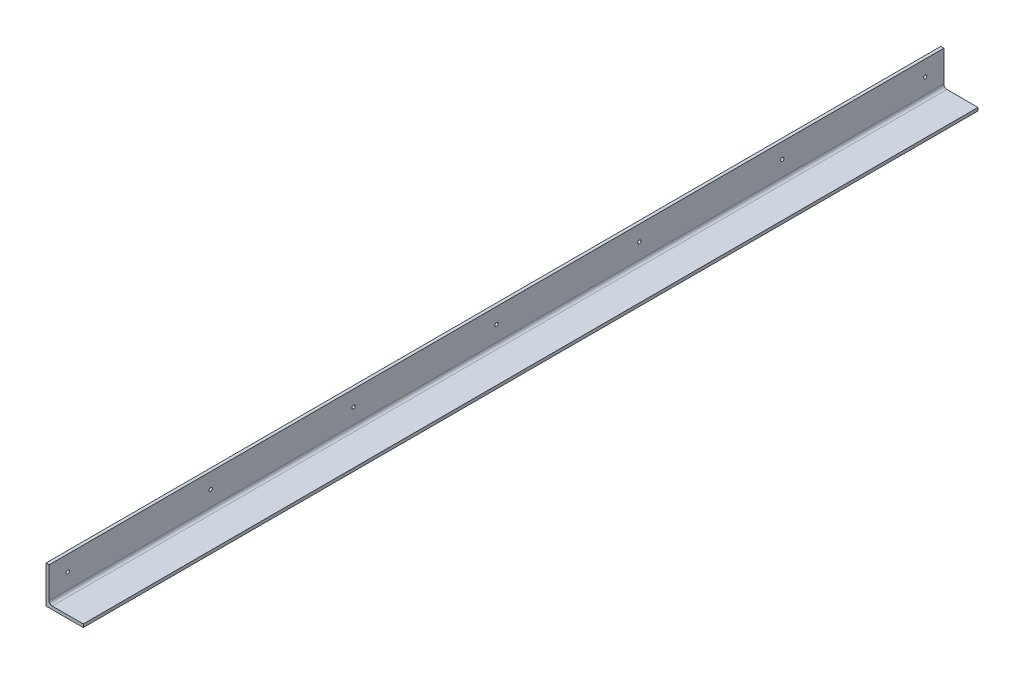
ISO-10303-21;
HEADER;
FILE_DESCRIPTION(('STEP AP214'),'2;1');
FILE_NAME('part.step','',(''),(''),'','','');
FILE_SCHEMA(('AUTOMOTIVE_DESIGN { 1 0 10303 214 1 1 1 1 }'));
ENDSEC;
DATA;
#1=APPLICATION_CONTEXT('core data for automotive mechanical design processes');
#2=APPLICATION_PROTOCOL_DEFINITION('international standard','automotive_design',2000,#1);
#3=PRODUCT_CONTEXT('',#1,'mechanical');
#4=PRODUCT('Part','Part','',(#3));
#5=PRODUCT_RELATED_PRODUCT_CATEGORY('part','',(#4));
#6=PRODUCT_DEFINITION_FORMATION('','',#4);
#7=PRODUCT_DEFINITION_CONTEXT('part definition',#1,'design');
#8=PRODUCT_DEFINITION('design','',#6,#7);
#9=PRODUCT_DEFINITION_SHAPE('','',#8);
#10=(LENGTH_UNIT() NAMED_UNIT(*) SI_UNIT(.MILLI.,.METRE.));
#11=(NAMED_UNIT(*) PLANE_ANGLE_UNIT() SI_UNIT($,.RADIAN.));
#12=(NAMED_UNIT(*) SI_UNIT($,.STERADIAN.) SOLID_ANGLE_UNIT());
#13=UNCERTAINTY_MEASURE_WITH_UNIT(LENGTH_MEASURE(1.E-05),#10,'distance_accuracy_value','');
#14=(GEOMETRIC_REPRESENTATION_CONTEXT(3) GLOBAL_UNCERTAINTY_ASSIGNED_CONTEXT((#13)) GLOBAL_UNIT_ASSIGNED_CONTEXT((#10,
#11,#12)) REPRESENTATION_CONTEXT('',''));
#15=CARTESIAN_POINT('',(0.,0.,0.));
#16=DIRECTION('',(0.,0.,1.));
#17=DIRECTION('',(1.,0.,0.));
#18=AXIS2_PLACEMENT_3D('',#15,#16,#17);
#19=CARTESIAN_POINT('',(76.2,0.,1828.8));
#20=DIRECTION('',(0.,1.,0.));
#21=DIRECTION('',(-1.,0.,0.));
#22=AXIS2_PLACEMENT_3D('',#19,#20,#21);
#23=PLANE('',#22);
#24=DIRECTION('',(1.,0.,0.));
#25=VECTOR('',#24,1.);
#26=CARTESIAN_POINT('',(76.2,0.,0.));
#27=LINE('',#26,#25);
#28=CARTESIAN_POINT('',(0.,0.,0.));
#29=VERTEX_POINT('',#28);
#30=CARTESIAN_POINT('',(76.2,0.,0.));
#31=VERTEX_POINT('',#30);
#32=EDGE_CURVE('E126',#29,#31,#27,.T.);
#33=ORIENTED_EDGE('',*,*,#32,.T.);
#34=DIRECTION('',(0.,0.,-1.));
#35=VECTOR('',#34,1.);
#36=CARTESIAN_POINT('',(76.2,0.,1828.8));
#37=LINE('',#36,#35);
#38=CARTESIAN_POINT('',(76.2,0.,1828.8));
#39=VERTEX_POINT('',#38);
#40=EDGE_CURVE('E11',#39,#31,#37,.T.);
#41=ORIENTED_EDGE('',*,*,#40,.F.);
#42=DIRECTION('',(1.,0.,0.));
#43=VECTOR('',#42,1.);
#44=CARTESIAN_POINT('',(76.2,0.,1828.8));
#45=LINE('',#44,#43);
#46=CARTESIAN_POINT('',(0.,0.,1828.8));
#47=VERTEX_POINT('',#46);
#48=EDGE_CURVE('E139',#47,#39,#45,.T.);
#49=ORIENTED_EDGE('',*,*,#48,.F.);
#50=DIRECTION('',(0.,0.,-1.));
#51=VECTOR('',#50,1.);
#52=CARTESIAN_POINT('',(0.,0.,1828.8));
#53=LINE('',#52,#51);
#54=EDGE_CURVE('E122',#47,#29,#53,.T.);
#55=ORIENTED_EDGE('',*,*,#54,.T.);
#56=EDGE_LOOP('',(#33,#41,#49,#55));
#57=FACE_BOUND('',#56,.T.);
#58=ADVANCED_FACE('F36',(#57),#23,.F.);
#59=CARTESIAN_POINT('',(76.2,6.35,1828.8));
#60=DIRECTION('',(-1.,0.,0.));
#61=DIRECTION('',(0.,0.,1.));
#62=AXIS2_PLACEMENT_3D('',#59,#60,#61);
#63=PLANE('',#62);
#64=DIRECTION('',(0.,1.,0.));
#65=VECTOR('',#64,1.);
#66=CARTESIAN_POINT('',(76.2,6.35,0.));
#67=LINE('',#66,#65);
#68=CARTESIAN_POINT('',(76.2,6.35,0.));
#69=VERTEX_POINT('',#68);
#70=EDGE_CURVE('E129',#31,#69,#67,.T.);
#71=ORIENTED_EDGE('',*,*,#70,.T.);
#72=DIRECTION('',(0.,0.,-1.));
#73=VECTOR('',#72,1.);
#74=CARTESIAN_POINT('',(76.2,6.35,1828.8));
#75=LINE('',#74,#73);
#76=CARTESIAN_POINT('',(76.2,6.35,1828.8));
#77=VERTEX_POINT('',#76);
#78=EDGE_CURVE('E44',#77,#69,#75,.T.);
#79=ORIENTED_EDGE('',*,*,#78,.F.);
#80=DIRECTION('',(0.,1.,0.));
#81=VECTOR('',#80,1.);
#82=CARTESIAN_POINT('',(76.2,6.35,1828.8));
#83=LINE('',#82,#81);
#84=EDGE_CURVE('E92',#39,#77,#83,.T.);
#85=ORIENTED_EDGE('',*,*,#84,.F.);
#86=ORIENTED_EDGE('',*,*,#40,.T.);
#87=EDGE_LOOP('',(#71,#79,#85,#86));
#88=FACE_BOUND('',#87,.T.);
#89=ADVANCED_FACE('F237',(#88),#63,.F.);
#90=CARTESIAN_POINT('',(12.7,6.35,1828.8));
#91=DIRECTION('',(0.,-1.,0.));
#92=DIRECTION('',(1.,0.,0.));
#93=AXIS2_PLACEMENT_3D('',#90,#91,#92);
#94=PLANE('',#93);
#95=DIRECTION('',(-1.,0.,0.));
#96=VECTOR('',#95,1.);
#97=CARTESIAN_POINT('',(12.7,6.35,0.));
#98=LINE('',#97,#96);
#99=CARTESIAN_POINT('',(12.7,6.35,0.));
#100=VERTEX_POINT('',#99);
#101=EDGE_CURVE('E132',#69,#100,#98,.T.);
#102=ORIENTED_EDGE('',*,*,#101,.T.);
#103=DIRECTION('',(0.,0.,-1.));
#104=VECTOR('',#103,1.);
#105=CARTESIAN_POINT('',(12.7,6.35,1828.8));
#106=LINE('',#105,#104);
#107=CARTESIAN_POINT('',(12.7,6.35,1828.8));
#108=VERTEX_POINT('',#107);
#109=EDGE_CURVE('E143',#108,#100,#106,.T.);
#110=ORIENTED_EDGE('',*,*,#109,.F.);
#111=DIRECTION('',(-1.,0.,0.));
#112=VECTOR('',#111,1.);
#113=CARTESIAN_POINT('',(12.7,6.35,1828.8));
#114=LINE('',#113,#112);
#115=EDGE_CURVE('E151',#77,#108,#114,.T.);
#116=ORIENTED_EDGE('',*,*,#115,.F.);
#117=ORIENTED_EDGE('',*,*,#78,.T.);
#118=EDGE_LOOP('',(#102,#110,#116,#117));
#119=FACE_BOUND('',#118,.T.);
#120=ADVANCED_FACE('F149',(#119),#94,.F.);
#121=CARTESIAN_POINT('',(12.7,12.7,1828.8));
#122=DIRECTION('',(0.,0.,-1.));
#123=DIRECTION('',(-1.,0.,0.));
#124=AXIS2_PLACEMENT_3D('',#121,#122,#123);
#125=CYLINDRICAL_SURFACE('',#124,6.35);
#126=CARTESIAN_POINT('',(12.7,12.7,0.));
#127=DIRECTION('',(0.,0.,-1.));
#128=DIRECTION('',(1.,0.,0.));
#129=AXIS2_PLACEMENT_3D('',#126,#127,#128);
#130=CIRCLE('',#129,6.35);
#131=CARTESIAN_POINT('',(6.35,12.7,0.));
#132=VERTEX_POINT('',#131);
#133=EDGE_CURVE('E134',#100,#132,#130,.T.);
#134=ORIENTED_EDGE('',*,*,#133,.T.);
#135=DIRECTION('',(0.,0.,-1.));
#136=VECTOR('',#135,1.);
#137=CARTESIAN_POINT('',(6.35,12.7,1828.8));
#138=LINE('',#137,#136);
#139=CARTESIAN_POINT('',(6.35,12.7,1828.8));
#140=VERTEX_POINT('',#139);
#141=EDGE_CURVE('E117',#140,#132,#138,.T.);
#142=ORIENTED_EDGE('',*,*,#141,.F.);
#143=CARTESIAN_POINT('',(12.7,12.7,1828.8));
#144=DIRECTION('',(0.,0.,-1.));
#145=DIRECTION('',(1.,0.,0.));
#146=AXIS2_PLACEMENT_3D('',#143,#144,#145);
#147=CIRCLE('',#146,6.35);
#148=EDGE_CURVE('E108',#108,#140,#147,.T.);
#149=ORIENTED_EDGE('',*,*,#148,.F.);
#150=ORIENTED_EDGE('',*,*,#109,.T.);
#151=EDGE_LOOP('',(#134,#142,#149,#150));
#152=FACE_BOUND('',#151,.T.);
#153=ADVANCED_FACE('F157',(#152),#125,.F.);
#154=CARTESIAN_POINT('',(6.34999999999999,76.2,1828.8));
#155=DIRECTION('',(-1.,0.,0.));
#156=DIRECTION('',(0.,-1.,0.));
#157=AXIS2_PLACEMENT_3D('',#154,#155,#156);
#158=PLANE('',#157);
#159=CARTESIAN_POINT('',(6.35,44.45,1790.7));
#160=DIRECTION('',(1.,0.,0.));
#161=DIRECTION('',(0.,0.,-1.));
#162=AXIS2_PLACEMENT_3D('',#159,#160,#161);
#163=CIRCLE('',#162,3.37344);
#164=CARTESIAN_POINT('',(6.35,44.45,1787.32656));
#165=VERTEX_POINT('',#164);
#166=EDGE_CURVE('E200',#165,#165,#163,.T.);
#167=ORIENTED_EDGE('',*,*,#166,.F.);
#168=EDGE_LOOP('',(#167));
#169=FACE_BOUND('',#168,.T.);
#170=CARTESIAN_POINT('',(6.35,44.45,1498.6));
#171=DIRECTION('',(1.,0.,0.));
#172=DIRECTION('',(0.,0.,-1.));
#173=AXIS2_PLACEMENT_3D('',#170,#171,#172);
#174=CIRCLE('',#173,3.37344);
#175=CARTESIAN_POINT('',(6.35,44.45,1495.22656));
#176=VERTEX_POINT('',#175);
#177=EDGE_CURVE('E194',#176,#176,#174,.T.);
#178=ORIENTED_EDGE('',*,*,#177,.F.);
#179=EDGE_LOOP('',(#178));
#180=FACE_BOUND('',#179,.T.);
#181=CARTESIAN_POINT('',(6.35,44.45,1206.5));
#182=DIRECTION('',(1.,0.,0.));
#183=DIRECTION('',(0.,0.,-1.));
#184=AXIS2_PLACEMENT_3D('',#181,#182,#183);
#185=CIRCLE('',#184,3.37344);
#186=CARTESIAN_POINT('',(6.35,44.45,1203.12656));
#187=VERTEX_POINT('',#186);
#188=EDGE_CURVE('E188',#187,#187,#185,.T.);
#189=ORIENTED_EDGE('',*,*,#188,.F.);
#190=EDGE_LOOP('',(#189));
#191=FACE_BOUND('',#190,.T.);
#192=CARTESIAN_POINT('',(6.35,44.45,914.4));
#193=DIRECTION('',(1.,0.,0.));
#194=DIRECTION('',(0.,0.,-1.));
#195=AXIS2_PLACEMENT_3D('',#192,#193,#194);
#196=CIRCLE('',#195,3.37344);
#197=CARTESIAN_POINT('',(6.35,44.45,911.02656));
#198=VERTEX_POINT('',#197);
#199=EDGE_CURVE('E182',#198,#198,#196,.T.);
#200=ORIENTED_EDGE('',*,*,#199,.F.);
#201=EDGE_LOOP('',(#200));
#202=FACE_BOUND('',#201,.T.);
#203=CARTESIAN_POINT('',(6.35,44.45,622.3));
#204=DIRECTION('',(1.,0.,0.));
#205=DIRECTION('',(0.,0.,-1.));
#206=AXIS2_PLACEMENT_3D('',#203,#204,#205);
#207=CIRCLE('',#206,3.37344);
#208=CARTESIAN_POINT('',(6.35,44.45,618.92656));
#209=VERTEX_POINT('',#208);
#210=EDGE_CURVE('E176',#209,#209,#207,.T.);
#211=ORIENTED_EDGE('',*,*,#210,.F.);
#212=EDGE_LOOP('',(#211));
#213=FACE_BOUND('',#212,.T.);
#214=CARTESIAN_POINT('',(6.35,44.45,330.2));
#215=DIRECTION('',(1.,0.,0.));
#216=DIRECTION('',(0.,0.,-1.));
#217=AXIS2_PLACEMENT_3D('',#214,#215,#216);
#218=CIRCLE('',#217,3.37344);
#219=CARTESIAN_POINT('',(6.35,44.45,326.82656));
#220=VERTEX_POINT('',#219);
#221=EDGE_CURVE('E170',#220,#220,#218,.T.);
#222=ORIENTED_EDGE('',*,*,#221,.F.);
#223=EDGE_LOOP('',(#222));
#224=FACE_BOUND('',#223,.T.);
#225=CARTESIAN_POINT('',(6.35,44.45,38.1000000000002));
#226=DIRECTION('',(1.,0.,0.));
#227=DIRECTION('',(0.,0.,-1.));
#228=AXIS2_PLACEMENT_3D('',#225,#226,#227);
#229=CIRCLE('',#228,3.37344);
#230=CARTESIAN_POINT('',(6.35,44.45,34.7265600000002));
#231=VERTEX_POINT('',#230);
#232=EDGE_CURVE('E164',#231,#231,#229,.T.);
#233=ORIENTED_EDGE('',*,*,#232,.F.);
#234=EDGE_LOOP('',(#233));
#235=FACE_BOUND('',#234,.T.);
#236=DIRECTION('',(0.,1.,0.));
#237=VECTOR('',#236,1.);
#238=CARTESIAN_POINT('',(6.34999999999999,76.2,0.));
#239=LINE('',#238,#237);
#240=CARTESIAN_POINT('',(6.34999999999999,76.2,0.));
#241=VERTEX_POINT('',#240);
#242=EDGE_CURVE('E116',#132,#241,#239,.T.);
#243=ORIENTED_EDGE('',*,*,#242,.T.);
#244=DIRECTION('',(0.,0.,-1.));
#245=VECTOR('',#244,1.);
#246=CARTESIAN_POINT('',(6.34999999999999,76.2,1828.8));
#247=LINE('',#246,#245);
#248=CARTESIAN_POINT('',(6.34999999999999,76.2,1828.8));
#249=VERTEX_POINT('',#248);
#250=EDGE_CURVE('E113',#249,#241,#247,.T.);
#251=ORIENTED_EDGE('',*,*,#250,.F.);
#252=DIRECTION('',(0.,1.,0.));
#253=VECTOR('',#252,1.);
#254=CARTESIAN_POINT('',(6.34999999999999,76.2,1828.8));
#255=LINE('',#254,#253);
#256=EDGE_CURVE('E102',#140,#249,#255,.T.);
#257=ORIENTED_EDGE('',*,*,#256,.F.);
#258=ORIENTED_EDGE('',*,*,#141,.T.);
#259=EDGE_LOOP('',(#243,#251,#257,#258));
#260=FACE_BOUND('',#259,.T.);
#261=ADVANCED_FACE('F114',(#169,#180,#191,#202,#213,#224,#235,#260),#158,.F.);
#262=CARTESIAN_POINT('',(0.,76.2,1828.8));
#263=DIRECTION('',(0.,-1.,0.));
#264=DIRECTION('',(0.,0.,-1.));
#265=AXIS2_PLACEMENT_3D('',#262,#263,#264);
#266=PLANE('',#265);
#267=DIRECTION('',(-1.,0.,0.));
#268=VECTOR('',#267,1.);
#269=CARTESIAN_POINT('',(0.,76.2,0.));
#270=LINE('',#269,#268);
#271=CARTESIAN_POINT('',(0.,76.2,0.));
#272=VERTEX_POINT('',#271);
#273=EDGE_CURVE('E78',#241,#272,#270,.T.);
#274=ORIENTED_EDGE('',*,*,#273,.T.);
#275=DIRECTION('',(0.,0.,-1.));
#276=VECTOR('',#275,1.);
#277=CARTESIAN_POINT('',(0.,76.2,1828.8));
#278=LINE('',#277,#276);
#279=CARTESIAN_POINT('',(0.,76.2,1828.8));
#280=VERTEX_POINT('',#279);
#281=EDGE_CURVE('E118',#280,#272,#278,.T.);
#282=ORIENTED_EDGE('',*,*,#281,.F.);
#283=DIRECTION('',(-1.,0.,0.));
#284=VECTOR('',#283,1.);
#285=CARTESIAN_POINT('',(0.,76.2,1828.8));
#286=LINE('',#285,#284);
#287=EDGE_CURVE('E106',#249,#280,#286,.T.);
#288=ORIENTED_EDGE('',*,*,#287,.F.);
#289=ORIENTED_EDGE('',*,*,#250,.T.);
#290=EDGE_LOOP('',(#274,#282,#288,#289));
#291=FACE_BOUND('',#290,.T.);
#292=ADVANCED_FACE('F120',(#291),#266,.F.);
#293=CARTESIAN_POINT('',(0.,0.,1828.8));
#294=DIRECTION('',(1.,0.,0.));
#295=DIRECTION('',(0.,0.,-1.));
#296=AXIS2_PLACEMENT_3D('',#293,#294,#295);
#297=PLANE('',#296);
#298=CARTESIAN_POINT('',(0.,44.45,1790.7));
#299=DIRECTION('',(1.,0.,0.));
#300=DIRECTION('',(0.,0.,-1.));
#301=AXIS2_PLACEMENT_3D('',#298,#299,#300);
#302=CIRCLE('',#301,3.37344);
#303=CARTESIAN_POINT('',(0.,44.45,1787.32656));
#304=VERTEX_POINT('',#303);
#305=EDGE_CURVE('E197',#304,#304,#302,.T.);
#306=ORIENTED_EDGE('',*,*,#305,.T.);
#307=EDGE_LOOP('',(#306));
#308=FACE_BOUND('',#307,.T.);
#309=CARTESIAN_POINT('',(0.,44.45,1498.6));
#310=DIRECTION('',(1.,0.,0.));
#311=DIRECTION('',(0.,0.,-1.));
#312=AXIS2_PLACEMENT_3D('',#309,#310,#311);
#313=CIRCLE('',#312,3.37344);
#314=CARTESIAN_POINT('',(0.,44.45,1495.22656));
#315=VERTEX_POINT('',#314);
#316=EDGE_CURVE('E191',#315,#315,#313,.T.);
#317=ORIENTED_EDGE('',*,*,#316,.T.);
#318=EDGE_LOOP('',(#317));
#319=FACE_BOUND('',#318,.T.);
#320=CARTESIAN_POINT('',(0.,44.45,1206.5));
#321=DIRECTION('',(1.,0.,0.));
#322=DIRECTION('',(0.,0.,-1.));
#323=AXIS2_PLACEMENT_3D('',#320,#321,#322);
#324=CIRCLE('',#323,3.37344);
#325=CARTESIAN_POINT('',(0.,44.45,1203.12656));
#326=VERTEX_POINT('',#325);
#327=EDGE_CURVE('E185',#326,#326,#324,.T.);
#328=ORIENTED_EDGE('',*,*,#327,.T.);
#329=EDGE_LOOP('',(#328));
#330=FACE_BOUND('',#329,.T.);
#331=CARTESIAN_POINT('',(0.,44.45,914.4));
#332=DIRECTION('',(1.,0.,0.));
#333=DIRECTION('',(0.,0.,-1.));
#334=AXIS2_PLACEMENT_3D('',#331,#332,#333);
#335=CIRCLE('',#334,3.37344);
#336=CARTESIAN_POINT('',(0.,44.45,911.02656));
#337=VERTEX_POINT('',#336);
#338=EDGE_CURVE('E179',#337,#337,#335,.T.);
#339=ORIENTED_EDGE('',*,*,#338,.T.);
#340=EDGE_LOOP('',(#339));
#341=FACE_BOUND('',#340,.T.);
#342=CARTESIAN_POINT('',(0.,44.45,622.3));
#343=DIRECTION('',(1.,0.,0.));
#344=DIRECTION('',(0.,0.,-1.));
#345=AXIS2_PLACEMENT_3D('',#342,#343,#344);
#346=CIRCLE('',#345,3.37344);
#347=CARTESIAN_POINT('',(0.,44.45,618.92656));
#348=VERTEX_POINT('',#347);
#349=EDGE_CURVE('E173',#348,#348,#346,.T.);
#350=ORIENTED_EDGE('',*,*,#349,.T.);
#351=EDGE_LOOP('',(#350));
#352=FACE_BOUND('',#351,.T.);
#353=CARTESIAN_POINT('',(0.,44.45,330.2));
#354=DIRECTION('',(1.,0.,0.));
#355=DIRECTION('',(0.,0.,-1.));
#356=AXIS2_PLACEMENT_3D('',#353,#354,#355);
#357=CIRCLE('',#356,3.37344);
#358=CARTESIAN_POINT('',(0.,44.45,326.82656));
#359=VERTEX_POINT('',#358);
#360=EDGE_CURVE('E167',#359,#359,#357,.T.);
#361=ORIENTED_EDGE('',*,*,#360,.T.);
#362=EDGE_LOOP('',(#361));
#363=FACE_BOUND('',#362,.T.);
#364=CARTESIAN_POINT('',(0.,44.45,38.1000000000002));
#365=DIRECTION('',(1.,0.,0.));
#366=DIRECTION('',(0.,0.,-1.));
#367=AXIS2_PLACEMENT_3D('',#364,#365,#366);
#368=CIRCLE('',#367,3.37344);
#369=CARTESIAN_POINT('',(0.,44.45,34.7265600000002));
#370=VERTEX_POINT('',#369);
#371=EDGE_CURVE('E130',#370,#370,#368,.T.);
#372=ORIENTED_EDGE('',*,*,#371,.T.);
#373=EDGE_LOOP('',(#372));
#374=FACE_BOUND('',#373,.T.);
#375=DIRECTION('',(0.,-1.,0.));
#376=VECTOR('',#375,1.);
#377=CARTESIAN_POINT('',(0.,0.,0.));
#378=LINE('',#377,#376);
#379=EDGE_CURVE('E84',#272,#29,#378,.T.);
#380=ORIENTED_EDGE('',*,*,#379,.T.);
#381=ORIENTED_EDGE('',*,*,#54,.F.);
#382=DIRECTION('',(0.,-1.,0.));
#383=VECTOR('',#382,1.);
#384=CARTESIAN_POINT('',(0.,0.,1828.8));
#385=LINE('',#384,#383);
#386=EDGE_CURVE('E52',#280,#47,#385,.T.);
#387=ORIENTED_EDGE('',*,*,#386,.F.);
#388=ORIENTED_EDGE('',*,*,#281,.T.);
#389=EDGE_LOOP('',(#380,#381,#387,#388));
#390=FACE_BOUND('',#389,.T.);
#391=ADVANCED_FACE('F244',(#308,#319,#330,#341,#352,#363,#374,#390),#297,.F.);
#392=CARTESIAN_POINT('',(12.7,12.7,1828.8));
#393=DIRECTION('',(0.,0.,1.));
#394=DIRECTION('',(1.,0.,0.));
#395=AXIS2_PLACEMENT_3D('',#392,#393,#394);
#396=PLANE('',#395);
#397=ORIENTED_EDGE('',*,*,#48,.T.);
#398=ORIENTED_EDGE('',*,*,#84,.T.);
#399=ORIENTED_EDGE('',*,*,#115,.T.);
#400=ORIENTED_EDGE('',*,*,#148,.T.);
#401=ORIENTED_EDGE('',*,*,#256,.T.);
#402=ORIENTED_EDGE('',*,*,#287,.T.);
#403=ORIENTED_EDGE('',*,*,#386,.T.);
#404=EDGE_LOOP('',(#397,#398,#399,#400,#401,#402,#403));
#405=FACE_BOUND('',#404,.T.);
#406=ADVANCED_FACE('F104',(#405),#396,.T.);
#407=CARTESIAN_POINT('',(12.7,12.7,0.));
#408=DIRECTION('',(0.,0.,1.));
#409=DIRECTION('',(1.,0.,0.));
#410=AXIS2_PLACEMENT_3D('',#407,#408,#409);
#411=PLANE('',#410);
#412=ORIENTED_EDGE('',*,*,#32,.F.);
#413=ORIENTED_EDGE('',*,*,#379,.F.);
#414=ORIENTED_EDGE('',*,*,#273,.F.);
#415=ORIENTED_EDGE('',*,*,#242,.F.);
#416=ORIENTED_EDGE('',*,*,#133,.F.);
#417=ORIENTED_EDGE('',*,*,#101,.F.);
#418=ORIENTED_EDGE('',*,*,#70,.F.);
#419=EDGE_LOOP('',(#412,#413,#414,#415,#416,#417,#418));
#420=FACE_BOUND('',#419,.T.);
#421=ADVANCED_FACE('F155',(#420),#411,.F.);
#422=CARTESIAN_POINT('',(6.35,44.45,38.1000000000002));
#423=DIRECTION('',(1.,0.,0.));
#424=DIRECTION('',(0.,0.,-1.));
#425=AXIS2_PLACEMENT_3D('',#422,#423,#424);
#426=CYLINDRICAL_SURFACE('',#425,3.37344);
#427=ORIENTED_EDGE('',*,*,#371,.F.);
#428=EDGE_LOOP('',(#427));
#429=FACE_BOUND('',#428,.T.);
#430=ORIENTED_EDGE('',*,*,#232,.T.);
#431=EDGE_LOOP('',(#430));
#432=FACE_BOUND('',#431,.T.);
#433=ADVANCED_FACE('F221',(#429,#432),#426,.F.);
#434=CARTESIAN_POINT('',(6.35,44.45,330.2));
#435=DIRECTION('',(1.,0.,0.));
#436=DIRECTION('',(0.,0.,-1.));
#437=AXIS2_PLACEMENT_3D('',#434,#435,#436);
#438=CYLINDRICAL_SURFACE('',#437,3.37344);
#439=ORIENTED_EDGE('',*,*,#360,.F.);
#440=EDGE_LOOP('',(#439));
#441=FACE_BOUND('',#440,.T.);
#442=ORIENTED_EDGE('',*,*,#221,.T.);
#443=EDGE_LOOP('',(#442));
#444=FACE_BOUND('',#443,.T.);
#445=ADVANCED_FACE('F223',(#441,#444),#438,.F.);
#446=CARTESIAN_POINT('',(6.35,44.45,622.3));
#447=DIRECTION('',(1.,0.,0.));
#448=DIRECTION('',(0.,0.,-1.));
#449=AXIS2_PLACEMENT_3D('',#446,#447,#448);
#450=CYLINDRICAL_SURFACE('',#449,3.37344);
#451=ORIENTED_EDGE('',*,*,#349,.F.);
#452=EDGE_LOOP('',(#451));
#453=FACE_BOUND('',#452,.T.);
#454=ORIENTED_EDGE('',*,*,#210,.T.);
#455=EDGE_LOOP('',(#454));
#456=FACE_BOUND('',#455,.T.);
#457=ADVANCED_FACE('F230',(#453,#456),#450,.F.);
#458=CARTESIAN_POINT('',(6.35,44.45,914.4));
#459=DIRECTION('',(1.,0.,0.));
#460=DIRECTION('',(0.,0.,-1.));
#461=AXIS2_PLACEMENT_3D('',#458,#459,#460);
#462=CYLINDRICAL_SURFACE('',#461,3.37344);
#463=ORIENTED_EDGE('',*,*,#338,.F.);
#464=EDGE_LOOP('',(#463));
#465=FACE_BOUND('',#464,.T.);
#466=ORIENTED_EDGE('',*,*,#199,.T.);
#467=EDGE_LOOP('',(#466));
#468=FACE_BOUND('',#467,.T.);
#469=ADVANCED_FACE('F306',(#465,#468),#462,.F.);
#470=CARTESIAN_POINT('',(6.35,44.45,1206.5));
#471=DIRECTION('',(1.,0.,0.));
#472=DIRECTION('',(0.,0.,-1.));
#473=AXIS2_PLACEMENT_3D('',#470,#471,#472);
#474=CYLINDRICAL_SURFACE('',#473,3.37344);
#475=ORIENTED_EDGE('',*,*,#327,.F.);
#476=EDGE_LOOP('',(#475));
#477=FACE_BOUND('',#476,.T.);
#478=ORIENTED_EDGE('',*,*,#188,.T.);
#479=EDGE_LOOP('',(#478));
#480=FACE_BOUND('',#479,.T.);
#481=ADVANCED_FACE('F315',(#477,#480),#474,.F.);
#482=CARTESIAN_POINT('',(6.35,44.45,1498.6));
#483=DIRECTION('',(1.,0.,0.));
#484=DIRECTION('',(0.,0.,-1.));
#485=AXIS2_PLACEMENT_3D('',#482,#483,#484);
#486=CYLINDRICAL_SURFACE('',#485,3.37344);
#487=ORIENTED_EDGE('',*,*,#316,.F.);
#488=EDGE_LOOP('',(#487));
#489=FACE_BOUND('',#488,.T.);
#490=ORIENTED_EDGE('',*,*,#177,.T.);
#491=EDGE_LOOP('',(#490));
#492=FACE_BOUND('',#491,.T.);
#493=ADVANCED_FACE('F324',(#489,#492),#486,.F.);
#494=CARTESIAN_POINT('',(6.35,44.45,1790.7));
#495=DIRECTION('',(1.,0.,0.));
#496=DIRECTION('',(0.,0.,-1.));
#497=AXIS2_PLACEMENT_3D('',#494,#495,#496);
#498=CYLINDRICAL_SURFACE('',#497,3.37344);
#499=ORIENTED_EDGE('',*,*,#305,.F.);
#500=EDGE_LOOP('',(#499));
#501=FACE_BOUND('',#500,.T.);
#502=ORIENTED_EDGE('',*,*,#166,.T.);
#503=EDGE_LOOP('',(#502));
#504=FACE_BOUND('',#503,.T.);
#505=ADVANCED_FACE('F204',(#501,#504),#498,.F.);
#506=CLOSED_SHELL('',(#58,#89,#120,#153,#261,#292,#391,#406,#421,#433,#445,#457,#469,#481,#493,#505));
#507=MANIFOLD_SOLID_BREP('B2',#506);
#508=ADVANCED_BREP_SHAPE_REPRESENTATION('',(#18,#507),#14);
#509=SHAPE_DEFINITION_REPRESENTATION(#9,#508);
ENDSEC;
END-ISO-10303-21;
